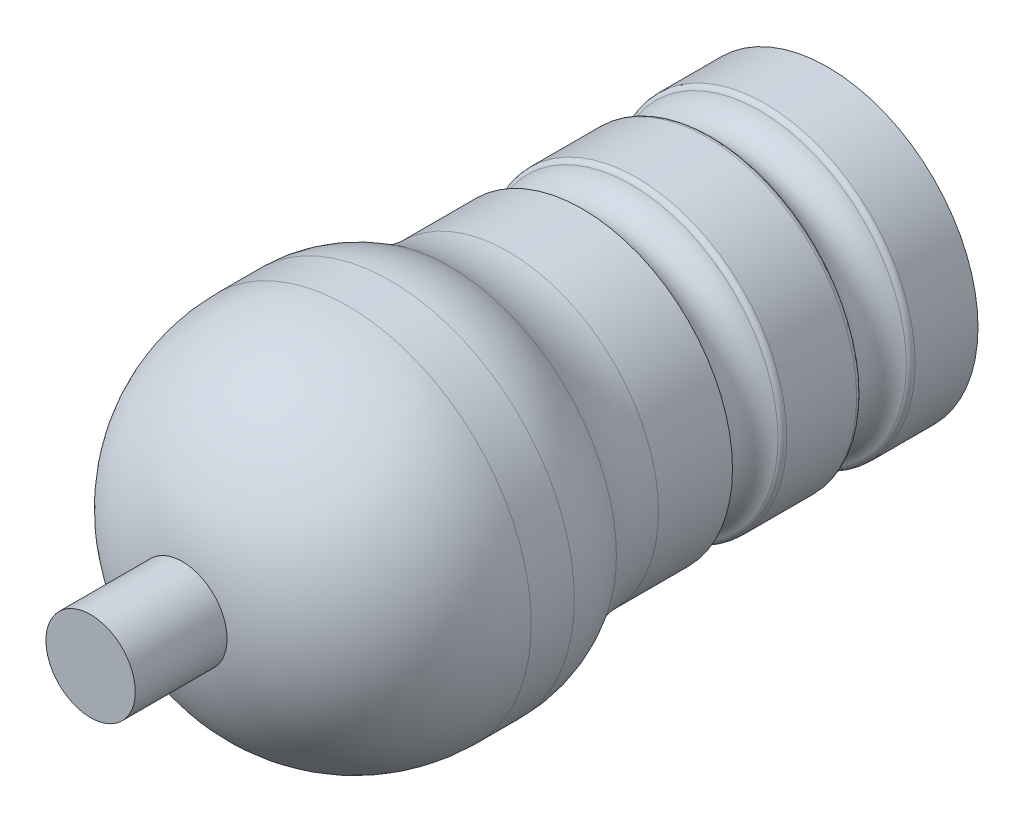
ISO-10303-21;
HEADER;
FILE_DESCRIPTION(('STEP AP214'),'2;1');
FILE_NAME('part.step','',(''),(''),'','','');
FILE_SCHEMA(('AUTOMOTIVE_DESIGN { 1 0 10303 214 1 1 1 1 }'));
ENDSEC;
DATA;
#1=APPLICATION_CONTEXT('core data for automotive mechanical design processes');
#2=APPLICATION_PROTOCOL_DEFINITION('international standard','automotive_design',2000,#1);
#3=PRODUCT_CONTEXT('',#1,'mechanical');
#4=PRODUCT('Part','Part','',(#3));
#5=PRODUCT_RELATED_PRODUCT_CATEGORY('part','',(#4));
#6=PRODUCT_DEFINITION_FORMATION('','',#4);
#7=PRODUCT_DEFINITION_CONTEXT('part definition',#1,'design');
#8=PRODUCT_DEFINITION('design','',#6,#7);
#9=PRODUCT_DEFINITION_SHAPE('','',#8);
#10=(LENGTH_UNIT() NAMED_UNIT(*) SI_UNIT(.MILLI.,.METRE.));
#11=(NAMED_UNIT(*) PLANE_ANGLE_UNIT() SI_UNIT($,.RADIAN.));
#12=(NAMED_UNIT(*) SI_UNIT($,.STERADIAN.) SOLID_ANGLE_UNIT());
#13=UNCERTAINTY_MEASURE_WITH_UNIT(LENGTH_MEASURE(1.E-05),#10,'distance_accuracy_value','');
#14=(GEOMETRIC_REPRESENTATION_CONTEXT(3) GLOBAL_UNCERTAINTY_ASSIGNED_CONTEXT((#13)) GLOBAL_UNIT_ASSIGNED_CONTEXT((#10,
#11,#12)) REPRESENTATION_CONTEXT('',''));
#15=CARTESIAN_POINT('',(0.,0.,0.));
#16=DIRECTION('',(0.,0.,1.));
#17=DIRECTION('',(1.,0.,0.));
#18=AXIS2_PLACEMENT_3D('',#15,#16,#17);
#19=CARTESIAN_POINT('',(0.,0.,12.594453726066));
#20=DIRECTION('',(0.,0.,1.));
#21=DIRECTION('',(1.,0.,0.));
#22=AXIS2_PLACEMENT_3D('',#19,#20,#21);
#23=CYLINDRICAL_SURFACE('',#22,16.45);
#24=CARTESIAN_POINT('',(0.,0.,1.23588215460886));
#25=DIRECTION('',(0.,0.,-1.));
#26=DIRECTION('',(-1.,0.,0.));
#27=AXIS2_PLACEMENT_3D('',#24,#25,#26);
#28=CIRCLE('',#27,16.45);
#29=CARTESIAN_POINT('',(-16.45,0.,1.23588215460886));
#30=VERTEX_POINT('',#29);
#31=EDGE_CURVE('E52',#30,#30,#28,.F.);
#32=ORIENTED_EDGE('',*,*,#31,.T.);
#33=EDGE_LOOP('',(#32));
#34=FACE_BOUND('',#33,.T.);
#35=CARTESIAN_POINT('',(0.,0.,5.09445372606601));
#36=DIRECTION('',(0.,0.,1.));
#37=DIRECTION('',(1.,0.,0.));
#38=AXIS2_PLACEMENT_3D('',#35,#36,#37);
#39=CIRCLE('',#38,16.45);
#40=CARTESIAN_POINT('',(16.45,0.,5.09445372606601));
#41=VERTEX_POINT('',#40);
#42=EDGE_CURVE('E91',#41,#41,#39,.T.);
#43=ORIENTED_EDGE('',*,*,#42,.F.);
#44=EDGE_LOOP('',(#43));
#45=FACE_BOUND('',#44,.T.);
#46=ADVANCED_FACE('F39',(#34,#45),#23,.T.);
#47=CARTESIAN_POINT('',(0.,0.,5.09445372606601));
#48=DIRECTION('',(0.,0.,1.));
#49=DIRECTION('',(1.,0.,0.));
#50=AXIS2_PLACEMENT_3D('',#47,#48,#49);
#51=DEGENERATE_TOROIDAL_SURFACE('',#50,1.45,15.,.T.);
#52=ORIENTED_EDGE('',*,*,#42,.T.);
#53=EDGE_LOOP('',(#52));
#54=FACE_BOUND('',#53,.T.);
#55=CARTESIAN_POINT('',(0.,0.,19.8761146611572));
#56=DIRECTION('',(0.,0.,1.));
#57=DIRECTION('',(1.,0.,0.));
#58=AXIS2_PLACEMENT_3D('',#55,#56,#57);
#59=CIRCLE('',#58,4.);
#60=CARTESIAN_POINT('',(4.,0.,19.8761146611572));
#61=VERTEX_POINT('',#60);
#62=EDGE_CURVE('E95',#61,#61,#59,.T.);
#63=ORIENTED_EDGE('',*,*,#62,.F.);
#64=EDGE_LOOP('',(#63));
#65=FACE_BOUND('',#64,.T.);
#66=ADVANCED_FACE('F108',(#54,#65),#51,.T.);
#67=CARTESIAN_POINT('',(0.,0.,12.594453726066));
#68=DIRECTION('',(0.,0.,1.));
#69=DIRECTION('',(1.,0.,0.));
#70=AXIS2_PLACEMENT_3D('',#67,#68,#69);
#71=CYLINDRICAL_SURFACE('',#70,4.);
#72=ORIENTED_EDGE('',*,*,#62,.T.);
#73=EDGE_LOOP('',(#72));
#74=FACE_BOUND('',#73,.T.);
#75=CARTESIAN_POINT('',(0.,0.,28.094453726066));
#76=DIRECTION('',(0.,0.,1.));
#77=DIRECTION('',(1.,0.,0.));
#78=AXIS2_PLACEMENT_3D('',#75,#76,#77);
#79=CIRCLE('',#78,4.);
#80=CARTESIAN_POINT('',(4.,0.,28.094453726066));
#81=VERTEX_POINT('',#80);
#82=EDGE_CURVE('E99',#81,#81,#79,.T.);
#83=ORIENTED_EDGE('',*,*,#82,.F.);
#84=EDGE_LOOP('',(#83));
#85=FACE_BOUND('',#84,.T.);
#86=ADVANCED_FACE('F106',(#74,#85),#71,.T.);
#87=CARTESIAN_POINT('',(4.,0.,28.094453726066));
#88=DIRECTION('',(0.,0.,1.));
#89=DIRECTION('',(1.,0.,0.));
#90=AXIS2_PLACEMENT_3D('',#87,#88,#89);
#91=PLANE('',#90);
#92=ORIENTED_EDGE('',*,*,#82,.T.);
#93=EDGE_LOOP('',(#92));
#94=FACE_BOUND('',#93,.T.);
#95=ADVANCED_FACE('F104',(#94),#91,.T.);
#96=CARTESIAN_POINT('',(0.,0.,-37.905546273934));
#97=DIRECTION('',(0.,0.,-1.));
#98=DIRECTION('',(-1.,0.,0.));
#99=AXIS2_PLACEMENT_3D('',#96,#97,#98);
#100=CYLINDRICAL_SURFACE('',#99,13.45);
#101=CARTESIAN_POINT('',(0.,0.,-9.29977159824388));
#102=DIRECTION('',(0.,0.,-1.));
#103=DIRECTION('',(-1.,0.,0.));
#104=AXIS2_PLACEMENT_3D('',#101,#102,#103);
#105=CIRCLE('',#104,13.45);
#106=CARTESIAN_POINT('',(-13.45,0.,-9.29977159824387));
#107=VERTEX_POINT('',#106);
#108=EDGE_CURVE('E47',#107,#107,#105,.T.);
#109=ORIENTED_EDGE('',*,*,#108,.T.);
#110=EDGE_LOOP('',(#109));
#111=FACE_BOUND('',#110,.T.);
#112=CARTESIAN_POINT('',(0.,0.,-15.9255685456765));
#113=DIRECTION('',(0.,0.,-1.));
#114=DIRECTION('',(-1.,0.,0.));
#115=AXIS2_PLACEMENT_3D('',#112,#113,#114);
#116=CIRCLE('',#115,13.45);
#117=CARTESIAN_POINT('',(-13.45,0.,-15.9255685456765));
#118=VERTEX_POINT('',#117);
#119=EDGE_CURVE('E83',#118,#118,#116,.T.);
#120=ORIENTED_EDGE('',*,*,#119,.F.);
#121=EDGE_LOOP('',(#120));
#122=FACE_BOUND('',#121,.T.);
#123=ADVANCED_FACE('F115',(#111,#122),#100,.T.);
#124=CARTESIAN_POINT('',(0.,0.,-18.1705629777409));
#125=DIRECTION('',(0.,0.,-1.));
#126=DIRECTION('',(-1.,0.,0.));
#127=AXIS2_PLACEMENT_3D('',#124,#125,#126);
#128=TOROIDAL_SURFACE('',#127,13.95,2.3);
#129=CARTESIAN_POINT('',(0.,0.,-20.3188774570574));
#130=DIRECTION('',(0.,0.,1.));
#131=DIRECTION('',(1.,0.,0.));
#132=AXIS2_PLACEMENT_3D('',#129,#130,#131);
#133=CIRCLE('',#132,13.1285714285714);
#134=CARTESIAN_POINT('',(13.1285714285714,0.,-20.3188774570574));
#135=VERTEX_POINT('',#134);
#136=EDGE_CURVE('E71',#135,#135,#133,.T.);
#137=ORIENTED_EDGE('',*,*,#136,.T.);
#138=EDGE_LOOP('',(#137));
#139=FACE_BOUND('',#138,.T.);
#140=ORIENTED_EDGE('',*,*,#119,.T.);
#141=EDGE_LOOP('',(#140));
#142=FACE_BOUND('',#141,.T.);
#143=ADVANCED_FACE('F142',(#139,#142),#128,.F.);
#144=CARTESIAN_POINT('',(0.,0.,-37.905546273934));
#145=DIRECTION('',(0.,0.,-1.));
#146=DIRECTION('',(-1.,0.,0.));
#147=AXIS2_PLACEMENT_3D('',#144,#145,#146);
#148=CYLINDRICAL_SURFACE('',#147,13.45);
#149=CARTESIAN_POINT('',(0.,0.,-20.7859023438653));
#150=DIRECTION('',(0.,0.,1.));
#151=DIRECTION('',(1.,0.,0.));
#152=AXIS2_PLACEMENT_3D('',#149,#150,#151);
#153=CIRCLE('',#152,13.45);
#154=CARTESIAN_POINT('',(13.45,0.,-20.7859023438653));
#155=VERTEX_POINT('',#154);
#156=EDGE_CURVE('E75',#155,#155,#153,.F.);
#157=ORIENTED_EDGE('',*,*,#156,.T.);
#158=EDGE_LOOP('',(#157));
#159=FACE_BOUND('',#158,.T.);
#160=CARTESIAN_POINT('',(0.,0.,-27.0452124757452));
#161=DIRECTION('',(0.,0.,1.));
#162=DIRECTION('',(1.,0.,0.));
#163=AXIS2_PLACEMENT_3D('',#160,#161,#162);
#164=CIRCLE('',#163,13.45);
#165=CARTESIAN_POINT('',(13.45,0.,-27.0452124757452));
#166=VERTEX_POINT('',#165);
#167=EDGE_CURVE('E79',#166,#166,#164,.T.);
#168=ORIENTED_EDGE('',*,*,#167,.T.);
#169=EDGE_LOOP('',(#168));
#170=FACE_BOUND('',#169,.T.);
#171=ADVANCED_FACE('F138',(#159,#170),#148,.T.);
#172=CARTESIAN_POINT('',(0.,0.,-29.6605518418696));
#173=DIRECTION('',(0.,0.,-1.));
#174=DIRECTION('',(-1.,0.,0.));
#175=AXIS2_PLACEMENT_3D('',#172,#173,#174);
#176=TOROIDAL_SURFACE('',#175,13.95,2.3);
#177=CARTESIAN_POINT('',(0.,0.,-27.5122373625531));
#178=DIRECTION('',(0.,0.,-1.));
#179=DIRECTION('',(-1.,0.,0.));
#180=AXIS2_PLACEMENT_3D('',#177,#178,#179);
#181=CIRCLE('',#180,13.1285714285714);
#182=CARTESIAN_POINT('',(-13.1285714285714,0.,-27.5122373625531));
#183=VERTEX_POINT('',#182);
#184=EDGE_CURVE('E63',#183,#183,#181,.T.);
#185=ORIENTED_EDGE('',*,*,#184,.T.);
#186=EDGE_LOOP('',(#185));
#187=FACE_BOUND('',#186,.T.);
#188=CARTESIAN_POINT('',(0.,0.,-31.8088663211861));
#189=DIRECTION('',(0.,0.,1.));
#190=DIRECTION('',(1.,0.,0.));
#191=AXIS2_PLACEMENT_3D('',#188,#189,#190);
#192=CIRCLE('',#191,13.1285714285714);
#193=CARTESIAN_POINT('',(13.1285714285714,0.,-31.8088663211861));
#194=VERTEX_POINT('',#193);
#195=EDGE_CURVE('E67',#194,#194,#192,.T.);
#196=ORIENTED_EDGE('',*,*,#195,.T.);
#197=EDGE_LOOP('',(#196));
#198=FACE_BOUND('',#197,.T.);
#199=ADVANCED_FACE('F134',(#187,#198),#176,.F.);
#200=CARTESIAN_POINT('',(0.,0.,-37.905546273934));
#201=DIRECTION('',(0.,0.,-1.));
#202=DIRECTION('',(-1.,0.,0.));
#203=AXIS2_PLACEMENT_3D('',#200,#201,#202);
#204=CYLINDRICAL_SURFACE('',#203,13.45);
#205=CARTESIAN_POINT('',(0.,0.,-32.275891207994));
#206=DIRECTION('',(0.,0.,1.));
#207=DIRECTION('',(1.,0.,0.));
#208=AXIS2_PLACEMENT_3D('',#205,#206,#207);
#209=CIRCLE('',#208,13.45);
#210=CARTESIAN_POINT('',(13.45,0.,-32.275891207994));
#211=VERTEX_POINT('',#210);
#212=EDGE_CURVE('E57',#211,#211,#209,.F.);
#213=ORIENTED_EDGE('',*,*,#212,.T.);
#214=EDGE_LOOP('',(#213));
#215=FACE_BOUND('',#214,.T.);
#216=CARTESIAN_POINT('',(0.,0.,-37.905546273934));
#217=DIRECTION('',(0.,0.,-1.));
#218=DIRECTION('',(-1.,0.,0.));
#219=AXIS2_PLACEMENT_3D('',#216,#217,#218);
#220=CIRCLE('',#219,13.45);
#221=CARTESIAN_POINT('',(-13.45,0.,-37.905546273934));
#222=VERTEX_POINT('',#221);
#223=EDGE_CURVE('E87',#222,#222,#220,.T.);
#224=ORIENTED_EDGE('',*,*,#223,.F.);
#225=EDGE_LOOP('',(#224));
#226=FACE_BOUND('',#225,.T.);
#227=ADVANCED_FACE('F130',(#215,#226),#204,.T.);
#228=CARTESIAN_POINT('',(13.45,0.,-37.905546273934));
#229=DIRECTION('',(0.,0.,1.));
#230=DIRECTION('',(1.,0.,0.));
#231=AXIS2_PLACEMENT_3D('',#228,#229,#230);
#232=PLANE('',#231);
#233=ORIENTED_EDGE('',*,*,#223,.T.);
#234=EDGE_LOOP('',(#233));
#235=FACE_BOUND('',#234,.T.);
#236=ADVANCED_FACE('F126',(#235),#232,.F.);
#237=CARTESIAN_POINT('',(0.,0.,-20.7859023438653));
#238=DIRECTION('',(0.,0.,1.));
#239=DIRECTION('',(1.,0.,0.));
#240=AXIS2_PLACEMENT_3D('',#237,#238,#239);
#241=TOROIDAL_SURFACE('',#240,12.95,0.5);
#242=ORIENTED_EDGE('',*,*,#136,.F.);
#243=EDGE_LOOP('',(#242));
#244=FACE_BOUND('',#243,.T.);
#245=ORIENTED_EDGE('',*,*,#156,.F.);
#246=EDGE_LOOP('',(#245));
#247=FACE_BOUND('',#246,.T.);
#248=ADVANCED_FACE('F129',(#244,#247),#241,.T.);
#249=CARTESIAN_POINT('',(0.,0.,-27.0452124757452));
#250=DIRECTION('',(0.,0.,1.));
#251=DIRECTION('',(1.,0.,0.));
#252=AXIS2_PLACEMENT_3D('',#249,#250,#251);
#253=TOROIDAL_SURFACE('',#252,12.95,0.5);
#254=ORIENTED_EDGE('',*,*,#167,.F.);
#255=EDGE_LOOP('',(#254));
#256=FACE_BOUND('',#255,.T.);
#257=ORIENTED_EDGE('',*,*,#184,.F.);
#258=EDGE_LOOP('',(#257));
#259=FACE_BOUND('',#258,.T.);
#260=ADVANCED_FACE('F151',(#256,#259),#253,.T.);
#261=CARTESIAN_POINT('',(0.,0.,-32.275891207994));
#262=DIRECTION('',(0.,0.,1.));
#263=DIRECTION('',(1.,0.,0.));
#264=AXIS2_PLACEMENT_3D('',#261,#262,#263);
#265=TOROIDAL_SURFACE('',#264,12.95,0.5);
#266=ORIENTED_EDGE('',*,*,#195,.F.);
#267=EDGE_LOOP('',(#266));
#268=FACE_BOUND('',#267,.T.);
#269=ORIENTED_EDGE('',*,*,#212,.F.);
#270=EDGE_LOOP('',(#269));
#271=FACE_BOUND('',#270,.T.);
#272=ADVANCED_FACE('F155',(#268,#271),#265,.T.);
#273=CARTESIAN_POINT('',(0.,0.,1.23588215460886));
#274=DIRECTION('',(0.,0.,-1.));
#275=DIRECTION('',(-1.,0.,0.));
#276=AXIS2_PLACEMENT_3D('',#273,#274,#275);
#277=DEGENERATE_TOROIDAL_SURFACE('',#276,6.45,10.,.T.);
#278=CARTESIAN_POINT('',(0.,0.,-4.03194472181751));
#279=DIRECTION('',(0.,0.,1.));
#280=DIRECTION('',(1.,0.,0.));
#281=AXIS2_PLACEMENT_3D('',#278,#279,#280);
#282=CIRCLE('',#281,14.95);
#283=CARTESIAN_POINT('',(14.95,0.,-4.03194472181751));
#284=VERTEX_POINT('',#283);
#285=EDGE_CURVE('E10',#284,#284,#282,.T.);
#286=ORIENTED_EDGE('',*,*,#285,.T.);
#287=EDGE_LOOP('',(#286));
#288=FACE_BOUND('',#287,.T.);
#289=ORIENTED_EDGE('',*,*,#31,.F.);
#290=EDGE_LOOP('',(#289));
#291=FACE_BOUND('',#290,.T.);
#292=ADVANCED_FACE('F158',(#288,#291),#277,.T.);
#293=CARTESIAN_POINT('',(0.,0.,-9.29977159824388));
#294=DIRECTION('',(0.,0.,-1.));
#295=DIRECTION('',(-1.,0.,0.));
#296=AXIS2_PLACEMENT_3D('',#293,#294,#295);
#297=TOROIDAL_SURFACE('',#296,23.45,10.);
#298=ORIENTED_EDGE('',*,*,#285,.F.);
#299=EDGE_LOOP('',(#298));
#300=FACE_BOUND('',#299,.T.);
#301=ORIENTED_EDGE('',*,*,#108,.F.);
#302=EDGE_LOOP('',(#301));
#303=FACE_BOUND('',#302,.T.);
#304=ADVANCED_FACE('F41',(#300,#303),#297,.F.);
#305=CLOSED_SHELL('',(#46,#66,#86,#95,#123,#143,#171,#199,#227,#236,#248,#260,#272,#292,#304));
#306=MANIFOLD_SOLID_BREP('B2',#305);
#307=ADVANCED_BREP_SHAPE_REPRESENTATION('',(#18,#306),#14);
#308=SHAPE_DEFINITION_REPRESENTATION(#9,#307);
ENDSEC;
END-ISO-10303-21;
